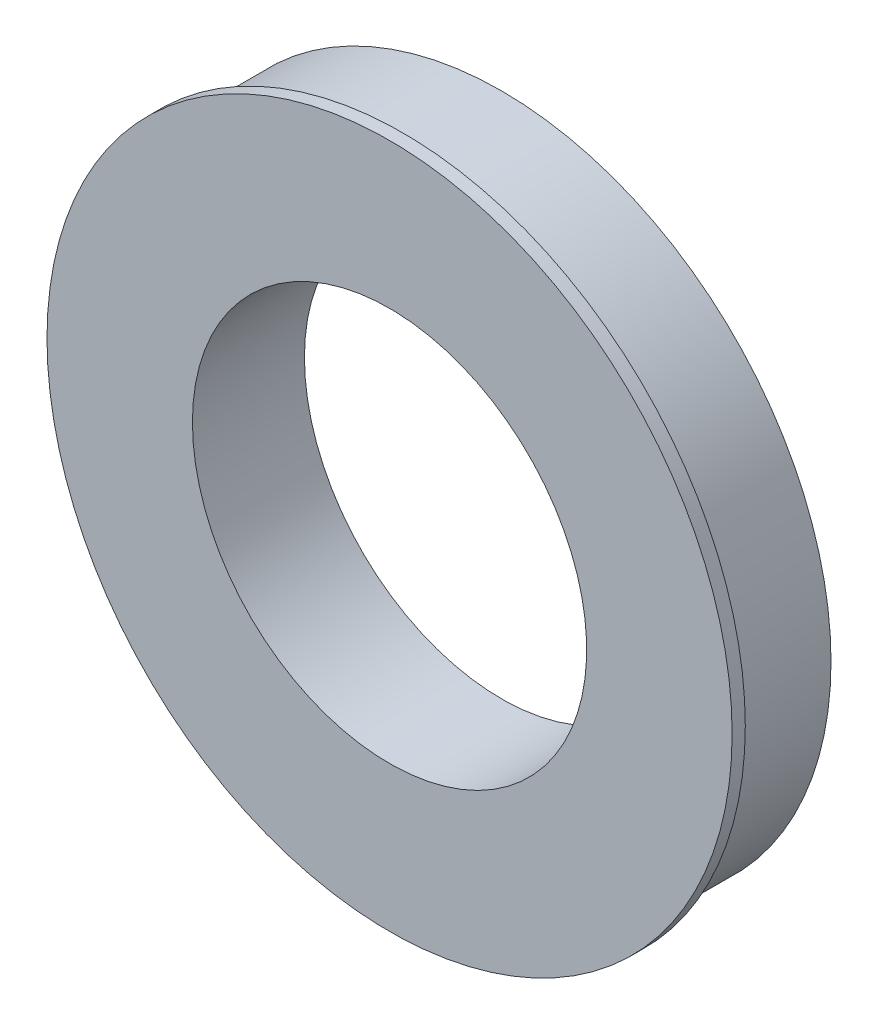
ISO-10303-21;
HEADER;
FILE_DESCRIPTION(('STEP AP214'),'2;1');
FILE_NAME('part.step','',(''),(''),'','','');
FILE_SCHEMA(('AUTOMOTIVE_DESIGN { 1 0 10303 214 1 1 1 1 }'));
ENDSEC;
DATA;
#1=APPLICATION_CONTEXT('core data for automotive mechanical design processes');
#2=APPLICATION_PROTOCOL_DEFINITION('international standard','automotive_design',2000,#1);
#3=PRODUCT_CONTEXT('',#1,'mechanical');
#4=PRODUCT('Part','Part','',(#3));
#5=PRODUCT_RELATED_PRODUCT_CATEGORY('part','',(#4));
#6=PRODUCT_DEFINITION_FORMATION('','',#4);
#7=PRODUCT_DEFINITION_CONTEXT('part definition',#1,'design');
#8=PRODUCT_DEFINITION('design','',#6,#7);
#9=PRODUCT_DEFINITION_SHAPE('','',#8);
#10=(LENGTH_UNIT() NAMED_UNIT(*) SI_UNIT(.MILLI.,.METRE.));
#11=(NAMED_UNIT(*) PLANE_ANGLE_UNIT() SI_UNIT($,.RADIAN.));
#12=(NAMED_UNIT(*) SI_UNIT($,.STERADIAN.) SOLID_ANGLE_UNIT());
#13=UNCERTAINTY_MEASURE_WITH_UNIT(LENGTH_MEASURE(1.E-05),#10,'distance_accuracy_value','');
#14=(GEOMETRIC_REPRESENTATION_CONTEXT(3) GLOBAL_UNCERTAINTY_ASSIGNED_CONTEXT((#13)) GLOBAL_UNIT_ASSIGNED_CONTEXT((#10,
#11,#12)) REPRESENTATION_CONTEXT('',''));
#15=CARTESIAN_POINT('',(0.,0.,0.));
#16=DIRECTION('',(0.,0.,1.));
#17=DIRECTION('',(1.,0.,0.));
#18=AXIS2_PLACEMENT_3D('',#15,#16,#17);
#19=CARTESIAN_POINT('',(0.,0.,0.));
#20=DIRECTION('',(0.,0.,1.));
#21=DIRECTION('',(1.,0.,0.));
#22=AXIS2_PLACEMENT_3D('',#19,#20,#21);
#23=PLANE('',#22);
#24=CARTESIAN_POINT('',(0.,0.,0.));
#25=DIRECTION('',(0.,0.,1.));
#26=DIRECTION('',(1.,0.,0.));
#27=AXIS2_PLACEMENT_3D('',#24,#25,#26);
#28=CIRCLE('',#27,63.5);
#29=CARTESIAN_POINT('',(-63.5,0.,0.));
#30=VERTEX_POINT('',#29);
#31=EDGE_CURVE('E43',#30,#30,#28,.T.);
#32=ORIENTED_EDGE('',*,*,#31,.F.);
#33=EDGE_LOOP('',(#32));
#34=FACE_BOUND('',#33,.T.);
#35=CARTESIAN_POINT('',(0.,0.,0.));
#36=DIRECTION('',(0.,0.,1.));
#37=DIRECTION('',(1.,0.,0.));
#38=AXIS2_PLACEMENT_3D('',#35,#36,#37);
#39=CIRCLE('',#38,38.);
#40=CARTESIAN_POINT('',(-38.,0.,0.));
#41=VERTEX_POINT('',#40);
#42=EDGE_CURVE('E50',#41,#41,#39,.T.);
#43=ORIENTED_EDGE('',*,*,#42,.T.);
#44=EDGE_LOOP('',(#43));
#45=FACE_BOUND('',#44,.T.);
#46=ADVANCED_FACE('F39',(#34,#45),#23,.F.);
#47=CARTESIAN_POINT('',(0.,0.,19.05));
#48=DIRECTION('',(0.,0.,-1.));
#49=DIRECTION('',(-1.,0.,0.));
#50=AXIS2_PLACEMENT_3D('',#47,#48,#49);
#51=CYLINDRICAL_SURFACE('',#50,63.5);
#52=CARTESIAN_POINT('',(0.,0.,19.05));
#53=DIRECTION('',(0.,0.,1.));
#54=DIRECTION('',(1.,0.,0.));
#55=AXIS2_PLACEMENT_3D('',#52,#53,#54);
#56=CIRCLE('',#55,63.5);
#57=CARTESIAN_POINT('',(-63.5,0.,19.05));
#58=VERTEX_POINT('',#57);
#59=EDGE_CURVE('E10',#58,#58,#56,.T.);
#60=CARTESIAN_POINT('',(-63.5,0.,19.05));
#61=CARTESIAN_POINT('',(-63.5,0.,18.8515625));
#62=CARTESIAN_POINT('',(-63.5,0.,18.653125));
#63=CARTESIAN_POINT('',(-63.5,0.,18.25625));
#64=CARTESIAN_POINT('',(-63.5,0.,18.0578125));
#65=CARTESIAN_POINT('',(-63.5,0.,17.6609375));
#66=CARTESIAN_POINT('',(-63.5,0.,17.4625));
#67=CARTESIAN_POINT('',(-63.5,0.,17.065625));
#68=CARTESIAN_POINT('',(-63.5,0.,16.8671875));
#69=CARTESIAN_POINT('',(-63.5,0.,16.4703125));
#70=CARTESIAN_POINT('',(-63.5,0.,16.271875));
#71=CARTESIAN_POINT('',(-63.5,0.,15.875));
#72=CARTESIAN_POINT('',(-63.5,0.,15.6765625));
#73=CARTESIAN_POINT('',(-63.5,0.,15.2796875));
#74=CARTESIAN_POINT('',(-63.5,0.,15.08125));
#75=CARTESIAN_POINT('',(-63.5,0.,14.684375));
#76=CARTESIAN_POINT('',(-63.5,0.,14.4859375));
#77=CARTESIAN_POINT('',(-63.5,0.,14.0890625));
#78=CARTESIAN_POINT('',(-63.5,0.,13.890625));
#79=CARTESIAN_POINT('',(-63.5,0.,13.49375));
#80=CARTESIAN_POINT('',(-63.5,0.,13.2953125));
#81=CARTESIAN_POINT('',(-63.5,0.,12.8984375));
#82=CARTESIAN_POINT('',(-63.5,0.,12.7));
#83=CARTESIAN_POINT('',(-63.5,0.,12.303125));
#84=CARTESIAN_POINT('',(-63.5,0.,12.1046875));
#85=CARTESIAN_POINT('',(-63.5,0.,11.7078125));
#86=CARTESIAN_POINT('',(-63.5,0.,11.509375));
#87=CARTESIAN_POINT('',(-63.5,0.,11.1125));
#88=CARTESIAN_POINT('',(-63.5,0.,10.9140625));
#89=CARTESIAN_POINT('',(-63.5,0.,10.5171875));
#90=CARTESIAN_POINT('',(-63.5,0.,10.31875));
#91=CARTESIAN_POINT('',(-63.5,0.,9.921875));
#92=CARTESIAN_POINT('',(-63.5,0.,9.7234375));
#93=CARTESIAN_POINT('',(-63.5,0.,9.3265625));
#94=CARTESIAN_POINT('',(-63.5,0.,9.128125));
#95=CARTESIAN_POINT('',(-63.5,0.,8.73125));
#96=CARTESIAN_POINT('',(-63.5,0.,8.5328125));
#97=CARTESIAN_POINT('',(-63.5,0.,8.1359375));
#98=CARTESIAN_POINT('',(-63.5,0.,7.9375));
#99=CARTESIAN_POINT('',(-63.5,0.,7.540625));
#100=CARTESIAN_POINT('',(-63.5,0.,7.3421875));
#101=CARTESIAN_POINT('',(-63.5,0.,6.9453125));
#102=CARTESIAN_POINT('',(-63.5,0.,6.746875));
#103=CARTESIAN_POINT('',(-63.5,0.,6.35));
#104=CARTESIAN_POINT('',(-63.5,0.,6.1515625));
#105=CARTESIAN_POINT('',(-63.5,0.,5.7546875));
#106=CARTESIAN_POINT('',(-63.5,0.,5.55625));
#107=CARTESIAN_POINT('',(-63.5,0.,5.159375));
#108=CARTESIAN_POINT('',(-63.5,0.,4.9609375));
#109=CARTESIAN_POINT('',(-63.5,0.,4.5640625));
#110=CARTESIAN_POINT('',(-63.5,0.,4.365625));
#111=CARTESIAN_POINT('',(-63.5,0.,3.96875));
#112=CARTESIAN_POINT('',(-63.5,0.,3.7703125));
#113=CARTESIAN_POINT('',(-63.5,0.,3.3734375));
#114=CARTESIAN_POINT('',(-63.5,0.,3.175));
#115=CARTESIAN_POINT('',(-63.5,0.,2.778125));
#116=CARTESIAN_POINT('',(-63.5,0.,2.5796875));
#117=CARTESIAN_POINT('',(-63.5,0.,2.1828125));
#118=CARTESIAN_POINT('',(-63.5,0.,1.984375));
#119=CARTESIAN_POINT('',(-63.5,0.,1.5875));
#120=CARTESIAN_POINT('',(-63.5,0.,1.3890625));
#121=CARTESIAN_POINT('',(-63.5,0.,0.992187500000001));
#122=CARTESIAN_POINT('',(-63.5,0.,0.793750000000001));
#123=CARTESIAN_POINT('',(-63.5,0.,0.396875));
#124=CARTESIAN_POINT('',(-63.5,0.,0.1984375));
#125=CARTESIAN_POINT('',(-63.5,0.,0.));
#126=B_SPLINE_CURVE_WITH_KNOTS('',3,(#60,#61,#62,#63,#64,#65,#66,#67,#68,#69,#70,#71,#72,#73,
#74,#75,#76,#77,#78,#79,#80,#81,#82,#83,#84,#85,#86,#87,#88,#89,#90,#91,#92,#93,#94,#95,#96,#97,
#98,#99,#100,#101,#102,#103,#104,#105,#106,#107,#108,#109,#110,#111,#112,#113,#114,#115,#116,
#117,#118,#119,#120,#121,#122,#123,#124,#125),.UNSPECIFIED.,.F.,.F.,(4,2,2,2,2,2,2,2,2,2,2,2,2,
2,2,2,2,2,2,2,2,2,2,2,2,2,2,2,2,2,2,2,4),(0.,0.5953125,1.190625,1.7859375,2.38125,2.9765625,
3.571875,4.1671875,4.7625,5.3578125,5.953125,6.5484375,7.14375,7.7390625,8.334375,8.9296875,
9.525,10.1203125,10.715625,11.3109375,11.90625,12.5015625,13.096875,13.6921875,14.2875,
14.8828125,15.478125,16.0734375,16.66875,17.2640625,17.859375,18.4546875,19.05),.UNSPECIFIED.);
#127=EDGE_CURVE('BSEAM41',#58,#30,#126,.T.);
#128=ORIENTED_EDGE('',*,*,#59,.F.);
#129=ORIENTED_EDGE('',*,*,#31,.T.);
#130=ORIENTED_EDGE('',*,*,#127,.T.);
#131=ORIENTED_EDGE('',*,*,#127,.F.);
#132=EDGE_LOOP('',(#128,#130,#129,#131));
#133=FACE_BOUND('',#132,.T.);
#134=ADVANCED_FACE('F41',(#133),#51,.T.);
#135=CARTESIAN_POINT('',(0.,0.,19.05));
#136=DIRECTION('',(0.,0.,-1.));
#137=DIRECTION('',(-1.,0.,0.));
#138=AXIS2_PLACEMENT_3D('',#135,#136,#137);
#139=CYLINDRICAL_SURFACE('',#138,38.);
#140=CARTESIAN_POINT('',(0.,0.,21.59));
#141=DIRECTION('',(0.,0.,1.));
#142=DIRECTION('',(1.,0.,0.));
#143=AXIS2_PLACEMENT_3D('',#140,#141,#142);
#144=CIRCLE('',#143,38.);
#145=CARTESIAN_POINT('',(-38.,0.,21.59));
#146=VERTEX_POINT('',#145);
#147=EDGE_CURVE('E58',#146,#146,#144,.T.);
#148=CARTESIAN_POINT('',(-38.,0.,0.));
#149=CARTESIAN_POINT('',(-38.,0.,0.224895833333333));
#150=CARTESIAN_POINT('',(-38.,0.,0.449791666666667));
#151=CARTESIAN_POINT('',(-38.,0.,0.899583333333333));
#152=CARTESIAN_POINT('',(-38.,0.,1.12447916666667));
#153=CARTESIAN_POINT('',(-38.,0.,1.57427083333333));
#154=CARTESIAN_POINT('',(-38.,0.,1.79916666666667));
#155=CARTESIAN_POINT('',(-38.,0.,2.24895833333333));
#156=CARTESIAN_POINT('',(-38.,0.,2.47385416666667));
#157=CARTESIAN_POINT('',(-38.,0.,2.92364583333333));
#158=CARTESIAN_POINT('',(-38.,0.,3.14854166666667));
#159=CARTESIAN_POINT('',(-38.,0.,3.59833333333333));
#160=CARTESIAN_POINT('',(-38.,0.,3.82322916666667));
#161=CARTESIAN_POINT('',(-38.,0.,4.27302083333333));
#162=CARTESIAN_POINT('',(-38.,0.,4.49791666666667));
#163=CARTESIAN_POINT('',(-38.,0.,4.94770833333333));
#164=CARTESIAN_POINT('',(-38.,0.,5.17260416666667));
#165=CARTESIAN_POINT('',(-38.,0.,5.62239583333333));
#166=CARTESIAN_POINT('',(-38.,0.,5.84729166666667));
#167=CARTESIAN_POINT('',(-38.,0.,6.29708333333333));
#168=CARTESIAN_POINT('',(-38.,0.,6.52197916666667));
#169=CARTESIAN_POINT('',(-38.,0.,6.97177083333333));
#170=CARTESIAN_POINT('',(-38.,0.,7.19666666666667));
#171=CARTESIAN_POINT('',(-38.,0.,7.64645833333333));
#172=CARTESIAN_POINT('',(-38.,0.,7.87135416666667));
#173=CARTESIAN_POINT('',(-38.,0.,8.32114583333333));
#174=CARTESIAN_POINT('',(-38.,0.,8.54604166666667));
#175=CARTESIAN_POINT('',(-38.,0.,8.99583333333334));
#176=CARTESIAN_POINT('',(-38.,0.,9.22072916666667));
#177=CARTESIAN_POINT('',(-38.,0.,9.67052083333333));
#178=CARTESIAN_POINT('',(-38.,0.,9.89541666666667));
#179=CARTESIAN_POINT('',(-38.,0.,10.3452083333333));
#180=CARTESIAN_POINT('',(-38.,0.,10.5701041666667));
#181=CARTESIAN_POINT('',(-38.,0.,11.0198958333333));
#182=CARTESIAN_POINT('',(-38.,0.,11.2447916666667));
#183=CARTESIAN_POINT('',(-38.,0.,11.6945833333333));
#184=CARTESIAN_POINT('',(-38.,0.,11.9194791666667));
#185=CARTESIAN_POINT('',(-38.,0.,12.3692708333333));
#186=CARTESIAN_POINT('',(-38.,0.,12.5941666666667));
#187=CARTESIAN_POINT('',(-38.,0.,13.0439583333333));
#188=CARTESIAN_POINT('',(-38.,0.,13.2688541666667));
#189=CARTESIAN_POINT('',(-38.,0.,13.7186458333333));
#190=CARTESIAN_POINT('',(-38.,0.,13.9435416666667));
#191=CARTESIAN_POINT('',(-38.,0.,14.3933333333333));
#192=CARTESIAN_POINT('',(-38.,0.,14.6182291666667));
#193=CARTESIAN_POINT('',(-38.,0.,15.0680208333333));
#194=CARTESIAN_POINT('',(-38.,0.,15.2929166666667));
#195=CARTESIAN_POINT('',(-38.,0.,15.7427083333333));
#196=CARTESIAN_POINT('',(-38.,0.,15.9676041666667));
#197=CARTESIAN_POINT('',(-38.,0.,16.4173958333333));
#198=CARTESIAN_POINT('',(-38.,0.,16.6422916666667));
#199=CARTESIAN_POINT('',(-38.,0.,17.0920833333333));
#200=CARTESIAN_POINT('',(-38.,0.,17.3169791666667));
#201=CARTESIAN_POINT('',(-38.,0.,17.7667708333333));
#202=CARTESIAN_POINT('',(-38.,0.,17.9916666666667));
#203=CARTESIAN_POINT('',(-38.,0.,18.4414583333333));
#204=CARTESIAN_POINT('',(-38.,0.,18.6663541666667));
#205=CARTESIAN_POINT('',(-38.,0.,19.1161458333333));
#206=CARTESIAN_POINT('',(-38.,0.,19.3410416666667));
#207=CARTESIAN_POINT('',(-38.,0.,19.7908333333333));
#208=CARTESIAN_POINT('',(-38.,0.,20.0157291666667));
#209=CARTESIAN_POINT('',(-38.,0.,20.4655208333333));
#210=CARTESIAN_POINT('',(-38.,0.,20.6904166666667));
#211=CARTESIAN_POINT('',(-38.,0.,21.1402083333333));
#212=CARTESIAN_POINT('',(-38.,0.,21.3651041666667));
#213=CARTESIAN_POINT('',(-38.,0.,21.59));
#214=B_SPLINE_CURVE_WITH_KNOTS('',3,(#148,#149,#150,#151,#152,#153,#154,#155,#156,#157,#158,
#159,#160,#161,#162,#163,#164,#165,#166,#167,#168,#169,#170,#171,#172,#173,#174,#175,#176,#177,
#178,#179,#180,#181,#182,#183,#184,#185,#186,#187,#188,#189,#190,#191,#192,#193,#194,#195,#196,
#197,#198,#199,#200,#201,#202,#203,#204,#205,#206,#207,#208,#209,#210,#211,#212,#213),
.UNSPECIFIED.,.F.,.F.,(4,2,2,2,2,2,2,2,2,2,2,2,2,2,2,2,2,2,2,2,2,2,2,2,2,2,2,2,2,2,2,2,4),(0.,
0.6746875,1.349375,2.0240625,2.69875,3.3734375,4.048125,4.7228125,5.3975,6.0721875,6.746875,
7.4215625,8.09625,8.7709375,9.445625,10.1203125,10.795,11.4696875,12.144375,12.8190625,13.49375,
14.1684375,14.843125,15.5178125,16.1925,16.8671875,17.541875,18.2165625,18.89125,19.5659375,
20.240625,20.9153125,21.59),.UNSPECIFIED.);
#215=EDGE_CURVE('BSEAM64',#41,#146,#214,.T.);
#216=ORIENTED_EDGE('',*,*,#42,.F.);
#217=ORIENTED_EDGE('',*,*,#147,.T.);
#218=ORIENTED_EDGE('',*,*,#215,.T.);
#219=ORIENTED_EDGE('',*,*,#215,.F.);
#220=EDGE_LOOP('',(#216,#218,#217,#219));
#221=FACE_BOUND('',#220,.T.);
#222=ADVANCED_FACE('F64',(#221),#139,.F.);
#223=CARTESIAN_POINT('',(0.,0.,21.59));
#224=DIRECTION('',(0.,0.,1.));
#225=DIRECTION('',(1.,0.,0.));
#226=AXIS2_PLACEMENT_3D('',#223,#224,#225);
#227=PLANE('',#226);
#228=CARTESIAN_POINT('',(0.,0.,21.59));
#229=DIRECTION('',(0.,0.,1.));
#230=DIRECTION('',(1.,0.,0.));
#231=AXIS2_PLACEMENT_3D('',#228,#229,#230);
#232=CIRCLE('',#231,66.03);
#233=CARTESIAN_POINT('',(66.03,0.,21.59));
#234=VERTEX_POINT('',#233);
#235=EDGE_CURVE('E54',#234,#234,#232,.T.);
#236=ORIENTED_EDGE('',*,*,#235,.T.);
#237=EDGE_LOOP('',(#236));
#238=FACE_BOUND('',#237,.T.);
#239=ORIENTED_EDGE('',*,*,#147,.F.);
#240=EDGE_LOOP('',(#239));
#241=FACE_BOUND('',#240,.T.);
#242=ADVANCED_FACE('F66',(#238,#241),#227,.T.);
#243=CARTESIAN_POINT('',(0.,0.,19.05));
#244=DIRECTION('',(0.,0.,1.));
#245=DIRECTION('',(1.,0.,0.));
#246=AXIS2_PLACEMENT_3D('',#243,#244,#245);
#247=PLANE('',#246);
#248=ORIENTED_EDGE('',*,*,#59,.T.);
#249=EDGE_LOOP('',(#248));
#250=FACE_BOUND('',#249,.T.);
#251=CARTESIAN_POINT('',(0.,0.,19.05));
#252=DIRECTION('',(0.,0.,1.));
#253=DIRECTION('',(1.,0.,0.));
#254=AXIS2_PLACEMENT_3D('',#251,#252,#253);
#255=CIRCLE('',#254,66.03);
#256=CARTESIAN_POINT('',(66.03,0.,19.05));
#257=VERTEX_POINT('',#256);
#258=EDGE_CURVE('E55',#257,#257,#255,.T.);
#259=ORIENTED_EDGE('',*,*,#258,.F.);
#260=EDGE_LOOP('',(#259));
#261=FACE_BOUND('',#260,.T.);
#262=ADVANCED_FACE('F68',(#250,#261),#247,.F.);
#263=CARTESIAN_POINT('',(0.,0.,21.59));
#264=DIRECTION('',(0.,0.,-1.));
#265=DIRECTION('',(-1.,0.,0.));
#266=AXIS2_PLACEMENT_3D('',#263,#264,#265);
#267=CYLINDRICAL_SURFACE('',#266,66.03);
#268=ORIENTED_EDGE('',*,*,#235,.F.);
#269=EDGE_LOOP('',(#268));
#270=FACE_BOUND('',#269,.T.);
#271=ORIENTED_EDGE('',*,*,#258,.T.);
#272=EDGE_LOOP('',(#271));
#273=FACE_BOUND('',#272,.T.);
#274=ADVANCED_FACE('F75',(#270,#273),#267,.T.);
#275=CLOSED_SHELL('',(#46,#134,#222,#242,#262,#274));
#276=MANIFOLD_SOLID_BREP('B2',#275);
#277=ADVANCED_BREP_SHAPE_REPRESENTATION('',(#18,#276),#14);
#278=SHAPE_DEFINITION_REPRESENTATION(#9,#277);
ENDSEC;
END-ISO-10303-21;
